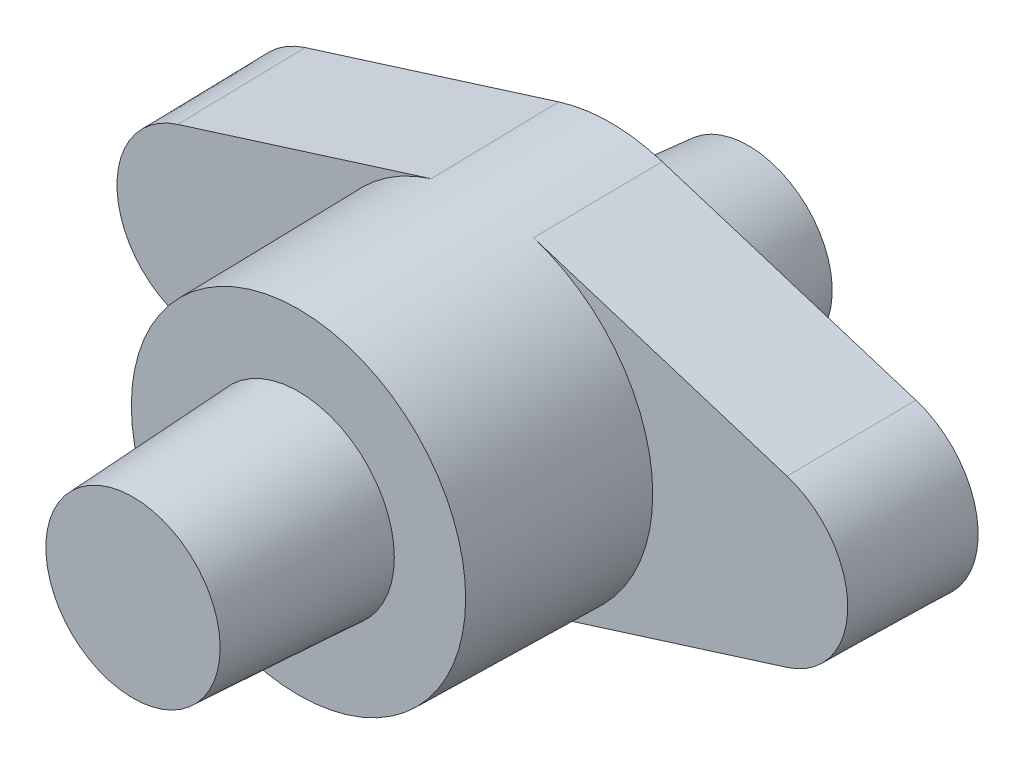
ISO-10303-21;
HEADER;
FILE_DESCRIPTION(('STEP AP214'),'2;1');
FILE_NAME('part.step','',(''),(''),'','','');
FILE_SCHEMA(('AUTOMOTIVE_DESIGN { 1 0 10303 214 1 1 1 1 }'));
ENDSEC;
DATA;
#1=APPLICATION_CONTEXT('core data for automotive mechanical design processes');
#2=APPLICATION_PROTOCOL_DEFINITION('international standard','automotive_design',2000,#1);
#3=PRODUCT_CONTEXT('',#1,'mechanical');
#4=PRODUCT('Part','Part','',(#3));
#5=PRODUCT_RELATED_PRODUCT_CATEGORY('part','',(#4));
#6=PRODUCT_DEFINITION_FORMATION('','',#4);
#7=PRODUCT_DEFINITION_CONTEXT('part definition',#1,'design');
#8=PRODUCT_DEFINITION('design','',#6,#7);
#9=PRODUCT_DEFINITION_SHAPE('','',#8);
#10=(LENGTH_UNIT() NAMED_UNIT(*) SI_UNIT(.MILLI.,.METRE.));
#11=(NAMED_UNIT(*) PLANE_ANGLE_UNIT() SI_UNIT($,.RADIAN.));
#12=(NAMED_UNIT(*) SI_UNIT($,.STERADIAN.) SOLID_ANGLE_UNIT());
#13=UNCERTAINTY_MEASURE_WITH_UNIT(LENGTH_MEASURE(1.E-05),#10,'distance_accuracy_value','');
#14=(GEOMETRIC_REPRESENTATION_CONTEXT(3) GLOBAL_UNCERTAINTY_ASSIGNED_CONTEXT((#13)) GLOBAL_UNIT_ASSIGNED_CONTEXT((#10,
#11,#12)) REPRESENTATION_CONTEXT('',''));
#15=CARTESIAN_POINT('',(0.,0.,0.));
#16=DIRECTION('',(0.,0.,1.));
#17=DIRECTION('',(1.,0.,0.));
#18=AXIS2_PLACEMENT_3D('',#15,#16,#17);
#19=CARTESIAN_POINT('',(0.,0.,53.3387391971892));
#20=DIRECTION('',(0.,0.,-1.));
#21=DIRECTION('',(1.,0.,0.));
#22=AXIS2_PLACEMENT_3D('',#19,#20,#21);
#23=CONICAL_SURFACE('',#22,17.37,0.05235987755983);
#24=CARTESIAN_POINT('',(0.,0.,83.3387391971892));
#25=DIRECTION('',(0.,0.,1.));
#26=DIRECTION('',(1.,0.,0.));
#27=AXIS2_PLACEMENT_3D('',#24,#25,#26);
#28=CIRCLE('',#27,15.7977666215088);
#29=CARTESIAN_POINT('',(15.7977666215088,0.,83.3387391971892));
#30=VERTEX_POINT('',#29);
#31=EDGE_CURVE('E12',#30,#30,#28,.T.);
#32=ORIENTED_EDGE('',*,*,#31,.F.);
#33=EDGE_LOOP('',(#32));
#34=FACE_BOUND('',#33,.T.);
#35=CARTESIAN_POINT('',(0.,0.,53.3387391971892));
#36=DIRECTION('',(0.,0.,1.));
#37=DIRECTION('',(1.,0.,0.));
#38=AXIS2_PLACEMENT_3D('',#35,#36,#37);
#39=CIRCLE('',#38,17.37);
#40=CARTESIAN_POINT('',(17.37,0.,53.3387391971892));
#41=VERTEX_POINT('',#40);
#42=EDGE_CURVE('E114',#41,#41,#39,.T.);
#43=ORIENTED_EDGE('',*,*,#42,.T.);
#44=EDGE_LOOP('',(#43));
#45=FACE_BOUND('',#44,.T.);
#46=ADVANCED_FACE('F43',(#34,#45),#23,.T.);
#47=CARTESIAN_POINT('',(0.,0.,83.3387391971892));
#48=DIRECTION('',(0.,0.,1.));
#49=DIRECTION('',(1.,0.,0.));
#50=AXIS2_PLACEMENT_3D('',#47,#48,#49);
#51=PLANE('',#50);
#52=ORIENTED_EDGE('',*,*,#31,.T.);
#53=EDGE_LOOP('',(#52));
#54=FACE_BOUND('',#53,.T.);
#55=ADVANCED_FACE('F225',(#54),#51,.T.);
#56=CARTESIAN_POINT('',(0.,0.,53.3387391971892));
#57=DIRECTION('',(0.,0.,1.));
#58=DIRECTION('',(1.,0.,0.));
#59=AXIS2_PLACEMENT_3D('',#56,#57,#58);
#60=PLANE('',#59);
#61=CARTESIAN_POINT('',(0.,0.,53.3387391971892));
#62=DIRECTION('',(0.,0.,1.));
#63=DIRECTION('',(1.,0.,0.));
#64=AXIS2_PLACEMENT_3D('',#61,#62,#63);
#65=CIRCLE('',#64,30.3);
#66=CARTESIAN_POINT('',(30.3,0.,53.3387391971892));
#67=VERTEX_POINT('',#66);
#68=EDGE_CURVE('E296',#67,#67,#65,.T.);
#69=ORIENTED_EDGE('',*,*,#68,.T.);
#70=EDGE_LOOP('',(#69));
#71=FACE_BOUND('',#70,.T.);
#72=ORIENTED_EDGE('',*,*,#42,.F.);
#73=EDGE_LOOP('',(#72));
#74=FACE_BOUND('',#73,.T.);
#75=ADVANCED_FACE('F219',(#71,#74),#60,.T.);
#76=CARTESIAN_POINT('',(50.5,0.,20.0087391971892));
#77=DIRECTION('',(0.,0.,1.));
#78=DIRECTION('',(1.,0.,0.));
#79=AXIS2_PLACEMENT_3D('',#76,#77,#78);
#80=PLANE('',#79);
#81=CARTESIAN_POINT('',(0.,0.,20.0087391971892));
#82=DIRECTION('',(0.,0.,1.));
#83=DIRECTION('',(1.,0.,0.));
#84=AXIS2_PLACEMENT_3D('',#81,#82,#83);
#85=CIRCLE('',#84,30.8817773140575);
#86=CARTESIAN_POINT('',(-9.26453319421725,29.459337989308,20.0087391971892));
#87=VERTEX_POINT('',#86);
#88=CARTESIAN_POINT('',(-9.26453319421725,-29.459337989308,20.0087391971892));
#89=VERTEX_POINT('',#88);
#90=EDGE_CURVE('E88',#87,#89,#85,.T.);
#91=ORIENTED_EDGE('',*,*,#90,.F.);
#92=DIRECTION('',(0.953939201416946,0.3,0.));
#93=VECTOR('',#92,1.);
#94=CARTESIAN_POINT('',(-9.26453319421725,29.459337989308,20.0087391971892));
#95=LINE('',#94,#93);
#96=CARTESIAN_POINT('',(-55.2195331942173,15.0071590878412,20.0087391971892));
#97=VERTEX_POINT('',#96);
#98=EDGE_CURVE('E123',#87,#97,#95,.F.);
#99=ORIENTED_EDGE('',*,*,#98,.T.);
#100=CARTESIAN_POINT('',(-50.5,0.,20.0087391971892));
#101=DIRECTION('',(0.,0.,1.));
#102=DIRECTION('',(1.,0.,0.));
#103=AXIS2_PLACEMENT_3D('',#100,#101,#102);
#104=CIRCLE('',#103,15.7317773140575);
#105=CARTESIAN_POINT('',(-55.2195331942172,-15.0071590878412,20.0087391971892));
#106=VERTEX_POINT('',#105);
#107=EDGE_CURVE('E82',#97,#106,#104,.T.);
#108=ORIENTED_EDGE('',*,*,#107,.T.);
#109=DIRECTION('',(-0.953939201416946,0.3,0.));
#110=VECTOR('',#109,1.);
#111=CARTESIAN_POINT('',(-9.26453319421725,-29.459337989308,20.0087391971892));
#112=LINE('',#111,#110);
#113=EDGE_CURVE('E47',#106,#89,#112,.F.);
#114=ORIENTED_EDGE('',*,*,#113,.T.);
#115=EDGE_LOOP('',(#91,#99,#108,#114));
#116=FACE_BOUND('',#115,.T.);
#117=ADVANCED_FACE('F86',(#116),#80,.T.);
#118=CARTESIAN_POINT('',(0.,0.,20.0087391971892));
#119=DIRECTION('',(0.,0.,1.));
#120=DIRECTION('',(1.,0.,0.));
#121=AXIS2_PLACEMENT_3D('',#118,#119,#120);
#122=CIRCLE('',#121,30.8817773140575);
#123=CARTESIAN_POINT('',(9.26453319421724,-29.4593379893079,20.0087391971892));
#124=VERTEX_POINT('',#123);
#125=CARTESIAN_POINT('',(9.26453319421724,29.459337989308,20.0087391971892));
#126=VERTEX_POINT('',#125);
#127=EDGE_CURVE('E111',#124,#126,#122,.T.);
#128=ORIENTED_EDGE('',*,*,#127,.F.);
#129=DIRECTION('',(-0.953939201416946,-0.3,0.));
#130=VECTOR('',#129,1.);
#131=CARTESIAN_POINT('',(9.26453319421724,-29.4593379893079,20.0087391971892));
#132=LINE('',#131,#130);
#133=CARTESIAN_POINT('',(55.2195331942172,-15.0071590878412,20.0087391971892));
#134=VERTEX_POINT('',#133);
#135=EDGE_CURVE('E63',#124,#134,#132,.F.);
#136=ORIENTED_EDGE('',*,*,#135,.T.);
#137=CARTESIAN_POINT('',(50.5,0.,20.0087391971892));
#138=DIRECTION('',(0.,0.,1.));
#139=DIRECTION('',(1.,0.,0.));
#140=AXIS2_PLACEMENT_3D('',#137,#138,#139);
#141=CIRCLE('',#140,15.7317773140575);
#142=CARTESIAN_POINT('',(55.2195331942172,15.0071590878412,20.0087391971892));
#143=VERTEX_POINT('',#142);
#144=EDGE_CURVE('E121',#134,#143,#141,.T.);
#145=ORIENTED_EDGE('',*,*,#144,.T.);
#146=DIRECTION('',(0.953939201416946,-0.3,0.));
#147=VECTOR('',#146,1.);
#148=CARTESIAN_POINT('',(9.26453319421725,29.459337989308,20.0087391971892));
#149=LINE('',#148,#147);
#150=EDGE_CURVE('E124',#143,#126,#149,.F.);
#151=ORIENTED_EDGE('',*,*,#150,.T.);
#152=EDGE_LOOP('',(#128,#136,#145,#151));
#153=FACE_BOUND('',#152,.T.);
#154=ADVANCED_FACE('F260',(#153),#80,.T.);
#155=CARTESIAN_POINT('',(50.5,0.,-3.22126080281077));
#156=DIRECTION('',(0.,0.,1.));
#157=DIRECTION('',(1.,0.,0.));
#158=AXIS2_PLACEMENT_3D('',#155,#156,#157);
#159=PLANE('',#158);
#160=CARTESIAN_POINT('',(0.,0.,-3.22126080281077));
#161=DIRECTION('',(0.,0.,1.));
#162=DIRECTION('',(1.,0.,0.));
#163=AXIS2_PLACEMENT_3D('',#160,#161,#162);
#164=CIRCLE('',#163,17.37);
#165=CARTESIAN_POINT('',(17.37,0.,-3.22126080281077));
#166=VERTEX_POINT('',#165);
#167=EDGE_CURVE('E110',#166,#166,#164,.F.);
#168=ORIENTED_EDGE('',*,*,#167,.F.);
#169=EDGE_LOOP('',(#168));
#170=FACE_BOUND('',#169,.T.);
#171=CARTESIAN_POINT('',(50.5,0.,-3.22126080281077));
#172=DIRECTION('',(0.,0.,1.));
#173=DIRECTION('',(1.,0.,0.));
#174=AXIS2_PLACEMENT_3D('',#171,#172,#173);
#175=CIRCLE('',#174,16.13725847234);
#176=CARTESIAN_POINT('',(55.341177541702,-15.3939634601628,-3.22126080281077));
#177=VERTEX_POINT('',#176);
#178=CARTESIAN_POINT('',(55.341177541702,15.3939634601629,-3.22126080281077));
#179=VERTEX_POINT('',#178);
#180=EDGE_CURVE('E154',#177,#179,#175,.T.);
#181=ORIENTED_EDGE('',*,*,#180,.F.);
#182=DIRECTION('',(-0.953939201416946,-0.3,0.));
#183=VECTOR('',#182,1.);
#184=CARTESIAN_POINT('',(9.38617754170199,-29.8461423616296,-3.22126080281077));
#185=LINE('',#184,#183);
#186=CARTESIAN_POINT('',(9.38617754170199,-29.8461423616296,-3.22126080281077));
#187=VERTEX_POINT('',#186);
#188=EDGE_CURVE('E129',#187,#177,#185,.F.);
#189=ORIENTED_EDGE('',*,*,#188,.F.);
#190=CARTESIAN_POINT('',(0.,0.,-3.22126080281077));
#191=DIRECTION('',(0.,0.,1.));
#192=DIRECTION('',(1.,0.,0.));
#193=AXIS2_PLACEMENT_3D('',#190,#191,#192);
#194=CIRCLE('',#193,31.28725847234);
#195=CARTESIAN_POINT('',(-9.386177541702,-29.8461423616296,-3.22126080281077));
#196=VERTEX_POINT('',#195);
#197=EDGE_CURVE('E159',#196,#187,#194,.T.);
#198=ORIENTED_EDGE('',*,*,#197,.F.);
#199=DIRECTION('',(-0.953939201416946,0.3,0.));
#200=VECTOR('',#199,1.);
#201=CARTESIAN_POINT('',(-9.386177541702,-29.8461423616296,-3.22126080281077));
#202=LINE('',#201,#200);
#203=CARTESIAN_POINT('',(-55.341177541702,-15.3939634601629,-3.22126080281077));
#204=VERTEX_POINT('',#203);
#205=EDGE_CURVE('E97',#204,#196,#202,.F.);
#206=ORIENTED_EDGE('',*,*,#205,.F.);
#207=CARTESIAN_POINT('',(-50.5,0.,-3.22126080281077));
#208=DIRECTION('',(0.,0.,1.));
#209=DIRECTION('',(1.,0.,0.));
#210=AXIS2_PLACEMENT_3D('',#207,#208,#209);
#211=CIRCLE('',#210,16.13725847234);
#212=CARTESIAN_POINT('',(-55.341177541702,15.3939634601628,-3.22126080281077));
#213=VERTEX_POINT('',#212);
#214=EDGE_CURVE('E162',#213,#204,#211,.T.);
#215=ORIENTED_EDGE('',*,*,#214,.F.);
#216=DIRECTION('',(0.953939201416946,0.3,0.));
#217=VECTOR('',#216,1.);
#218=CARTESIAN_POINT('',(-9.386177541702,29.8461423616296,-3.22126080281077));
#219=LINE('',#218,#217);
#220=CARTESIAN_POINT('',(-9.386177541702,29.8461423616296,-3.22126080281077));
#221=VERTEX_POINT('',#220);
#222=EDGE_CURVE('E164',#221,#213,#219,.F.);
#223=ORIENTED_EDGE('',*,*,#222,.F.);
#224=CARTESIAN_POINT('',(0.,0.,-3.22126080281077));
#225=DIRECTION('',(0.,0.,1.));
#226=DIRECTION('',(1.,0.,0.));
#227=AXIS2_PLACEMENT_3D('',#224,#225,#226);
#228=CIRCLE('',#227,31.28725847234);
#229=CARTESIAN_POINT('',(9.38617754170199,29.8461423616296,-3.22126080281077));
#230=VERTEX_POINT('',#229);
#231=EDGE_CURVE('E131',#230,#221,#228,.T.);
#232=ORIENTED_EDGE('',*,*,#231,.F.);
#233=DIRECTION('',(0.953939201416946,-0.3,0.));
#234=VECTOR('',#233,1.);
#235=CARTESIAN_POINT('',(9.386177541702,29.8461423616296,-3.22126080281077));
#236=LINE('',#235,#234);
#237=EDGE_CURVE('E151',#179,#230,#236,.F.);
#238=ORIENTED_EDGE('',*,*,#237,.F.);
#239=EDGE_LOOP('',(#181,#189,#198,#206,#215,#223,#232,#238));
#240=FACE_BOUND('',#239,.T.);
#241=ADVANCED_FACE('F179',(#170,#240),#159,.F.);
#242=CARTESIAN_POINT('',(50.5,0.,53.3387391971892));
#243=DIRECTION('',(0.,0.,-1.));
#244=DIRECTION('',(1.,0.,0.));
#245=AXIS2_PLACEMENT_3D('',#242,#243,#244);
#246=CONICAL_SURFACE('',#245,15.15,0.0174532925199433);
#247=ORIENTED_EDGE('',*,*,#180,.T.);
#248=DIRECTION('',(0.00523572193118507,0.0166485346595862,-0.999847695156391));
#249=VECTOR('',#248,1.);
#250=CARTESIAN_POINT('',(55.045,14.4521789014667,53.3387391971892));
#251=LINE('',#250,#249);
#252=EDGE_CURVE('E117',#143,#179,#251,.T.);
#253=ORIENTED_EDGE('',*,*,#252,.F.);
#254=ORIENTED_EDGE('',*,*,#144,.F.);
#255=DIRECTION('',(0.00523572193118506,-0.0166485346595862,-0.999847695156391));
#256=VECTOR('',#255,1.);
#257=CARTESIAN_POINT('',(55.045,-14.4521789014667,53.3387391971892));
#258=LINE('',#257,#256);
#259=EDGE_CURVE('E133',#134,#177,#258,.T.);
#260=ORIENTED_EDGE('',*,*,#259,.T.);
#261=EDGE_LOOP('',(#247,#253,#254,#260));
#262=FACE_BOUND('',#261,.T.);
#263=ADVANCED_FACE('F199',(#262),#246,.T.);
#264=CARTESIAN_POINT('',(9.09,28.9043578029335,53.3387391971892));
#265=DIRECTION('',(0.299954308546917,0.953793911856062,0.0174524064372835));
#266=DIRECTION('',(-0.953939201416946,0.3,0.));
#267=AXIS2_PLACEMENT_3D('',#264,#265,#266);
#268=PLANE('',#267);
#269=ORIENTED_EDGE('',*,*,#237,.T.);
#270=DIRECTION('',(0.00523572193118506,0.0166485346595862,-0.999847695156391));
#271=VECTOR('',#270,1.);
#272=CARTESIAN_POINT('',(9.08999999999999,28.9043578029334,53.3387391971892));
#273=LINE('',#272,#271);
#274=EDGE_CURVE('E145',#126,#230,#273,.T.);
#275=ORIENTED_EDGE('',*,*,#274,.F.);
#276=ORIENTED_EDGE('',*,*,#150,.F.);
#277=ORIENTED_EDGE('',*,*,#252,.T.);
#278=EDGE_LOOP('',(#269,#275,#276,#277));
#279=FACE_BOUND('',#278,.T.);
#280=ADVANCED_FACE('F232',(#279),#268,.T.);
#281=CARTESIAN_POINT('',(-9.09000000000001,28.9043578029335,53.3387391971892));
#282=DIRECTION('',(-0.299954308546917,0.953793911856062,0.0174524064372835));
#283=DIRECTION('',(-0.953939201416946,-0.3,0.));
#284=AXIS2_PLACEMENT_3D('',#281,#282,#283);
#285=PLANE('',#284);
#286=ORIENTED_EDGE('',*,*,#222,.T.);
#287=DIRECTION('',(-0.00523572193118507,0.0166485346595862,-0.999847695156391));
#288=VECTOR('',#287,1.);
#289=CARTESIAN_POINT('',(-55.045,14.4521789014667,53.3387391971892));
#290=LINE('',#289,#288);
#291=EDGE_CURVE('E146',#97,#213,#290,.T.);
#292=ORIENTED_EDGE('',*,*,#291,.F.);
#293=ORIENTED_EDGE('',*,*,#98,.F.);
#294=DIRECTION('',(-0.00523572193118507,0.0166485346595862,-0.999847695156391));
#295=VECTOR('',#294,1.);
#296=CARTESIAN_POINT('',(-9.09,28.9043578029335,53.3387391971892));
#297=LINE('',#296,#295);
#298=EDGE_CURVE('E108',#87,#221,#297,.T.);
#299=ORIENTED_EDGE('',*,*,#298,.T.);
#300=EDGE_LOOP('',(#286,#292,#293,#299));
#301=FACE_BOUND('',#300,.T.);
#302=ADVANCED_FACE('F177',(#301),#285,.T.);
#303=CARTESIAN_POINT('',(-50.5,0.,53.3387391971892));
#304=DIRECTION('',(0.,0.,-1.));
#305=DIRECTION('',(1.,0.,0.));
#306=AXIS2_PLACEMENT_3D('',#303,#304,#305);
#307=CONICAL_SURFACE('',#306,15.15,0.0174532925199433);
#308=ORIENTED_EDGE('',*,*,#214,.T.);
#309=DIRECTION('',(-0.00523572193118506,-0.0166485346595862,-0.999847695156391));
#310=VECTOR('',#309,1.);
#311=CARTESIAN_POINT('',(-55.045,-14.4521789014667,53.3387391971892));
#312=LINE('',#311,#310);
#313=EDGE_CURVE('E101',#106,#204,#312,.T.);
#314=ORIENTED_EDGE('',*,*,#313,.F.);
#315=ORIENTED_EDGE('',*,*,#107,.F.);
#316=ORIENTED_EDGE('',*,*,#291,.T.);
#317=EDGE_LOOP('',(#308,#314,#315,#316));
#318=FACE_BOUND('',#317,.T.);
#319=ADVANCED_FACE('F183',(#318),#307,.T.);
#320=CARTESIAN_POINT('',(-9.09,-28.9043578029335,53.3387391971892));
#321=DIRECTION('',(-0.299954308546917,-0.953793911856062,0.0174524064372835));
#322=DIRECTION('',(0.953939201416946,-0.3,0.));
#323=AXIS2_PLACEMENT_3D('',#320,#321,#322);
#324=PLANE('',#323);
#325=ORIENTED_EDGE('',*,*,#205,.T.);
#326=DIRECTION('',(-0.00523572193118507,-0.0166485346595862,-0.999847695156391));
#327=VECTOR('',#326,1.);
#328=CARTESIAN_POINT('',(-9.09,-28.9043578029334,53.3387391971892));
#329=LINE('',#328,#327);
#330=EDGE_CURVE('E94',#89,#196,#329,.T.);
#331=ORIENTED_EDGE('',*,*,#330,.F.);
#332=ORIENTED_EDGE('',*,*,#113,.F.);
#333=ORIENTED_EDGE('',*,*,#313,.T.);
#334=EDGE_LOOP('',(#325,#331,#332,#333));
#335=FACE_BOUND('',#334,.T.);
#336=ADVANCED_FACE('F45',(#335),#324,.T.);
#337=CARTESIAN_POINT('',(0.,0.,53.3387391971892));
#338=DIRECTION('',(0.,0.,-1.));
#339=DIRECTION('',(1.,0.,0.));
#340=AXIS2_PLACEMENT_3D('',#337,#338,#339);
#341=CONICAL_SURFACE('',#340,30.3,0.0174532925199433);
#342=ORIENTED_EDGE('',*,*,#197,.T.);
#343=DIRECTION('',(0.00523572193118506,-0.0166485346595862,-0.999847695156391));
#344=VECTOR('',#343,1.);
#345=CARTESIAN_POINT('',(9.08999999999999,-28.9043578029334,53.3387391971892));
#346=LINE('',#345,#344);
#347=EDGE_CURVE('E102',#124,#187,#346,.T.);
#348=ORIENTED_EDGE('',*,*,#347,.F.);
#349=ORIENTED_EDGE('',*,*,#127,.T.);
#350=ORIENTED_EDGE('',*,*,#274,.T.);
#351=ORIENTED_EDGE('',*,*,#231,.T.);
#352=ORIENTED_EDGE('',*,*,#298,.F.);
#353=ORIENTED_EDGE('',*,*,#90,.T.);
#354=ORIENTED_EDGE('',*,*,#330,.T.);
#355=EDGE_LOOP('',(#342,#348,#349,#350,#351,#352,#353,#354));
#356=FACE_BOUND('',#355,.T.);
#357=ORIENTED_EDGE('',*,*,#68,.F.);
#358=EDGE_LOOP('',(#357));
#359=FACE_BOUND('',#358,.T.);
#360=ADVANCED_FACE('F104',(#356,#359),#341,.T.);
#361=CARTESIAN_POINT('',(9.08999999999999,-28.9043578029334,53.3387391971892));
#362=DIRECTION('',(0.299954308546917,-0.953793911856062,0.0174524064372835));
#363=DIRECTION('',(0.953939201416946,0.3,0.));
#364=AXIS2_PLACEMENT_3D('',#361,#362,#363);
#365=PLANE('',#364);
#366=ORIENTED_EDGE('',*,*,#188,.T.);
#367=ORIENTED_EDGE('',*,*,#259,.F.);
#368=ORIENTED_EDGE('',*,*,#135,.F.);
#369=ORIENTED_EDGE('',*,*,#347,.T.);
#370=EDGE_LOOP('',(#366,#367,#368,#369));
#371=FACE_BOUND('',#370,.T.);
#372=ADVANCED_FACE('F197',(#371),#365,.T.);
#373=CARTESIAN_POINT('',(0.,0.,-3.22126080281077));
#374=DIRECTION('',(0.,0.,1.));
#375=DIRECTION('',(-1.,0.,0.));
#376=AXIS2_PLACEMENT_3D('',#373,#374,#375);
#377=CONICAL_SURFACE('',#376,17.37,0.0872664625997166);
#378=CARTESIAN_POINT('',(0.,0.,-28.2212608028108));
#379=DIRECTION('',(0.,0.,-1.));
#380=DIRECTION('',(-1.,0.,0.));
#381=AXIS2_PLACEMENT_3D('',#378,#379,#380);
#382=CIRCLE('',#381,15.1827834118519);
#383=CARTESIAN_POINT('',(-15.1827834118519,0.,-28.2212608028108));
#384=VERTEX_POINT('',#383);
#385=EDGE_CURVE('E297',#384,#384,#382,.T.);
#386=ORIENTED_EDGE('',*,*,#385,.F.);
#387=EDGE_LOOP('',(#386));
#388=FACE_BOUND('',#387,.T.);
#389=ORIENTED_EDGE('',*,*,#167,.T.);
#390=EDGE_LOOP('',(#389));
#391=FACE_BOUND('',#390,.T.);
#392=ADVANCED_FACE('F243',(#388,#391),#377,.T.);
#393=CARTESIAN_POINT('',(0.,0.,-28.2212608028108));
#394=DIRECTION('',(0.,0.,-1.));
#395=DIRECTION('',(-1.,0.,0.));
#396=AXIS2_PLACEMENT_3D('',#393,#394,#395);
#397=PLANE('',#396);
#398=ORIENTED_EDGE('',*,*,#385,.T.);
#399=EDGE_LOOP('',(#398));
#400=FACE_BOUND('',#399,.T.);
#401=ADVANCED_FACE('F247',(#400),#397,.T.);
#402=CLOSED_SHELL('',(#46,#55,#75,#117,#154,#241,#263,#280,#302,#319,#336,#360,#372,#392,#401));
#403=CARTESIAN_POINT('',(0.,0.,-28.0212608028108));
#404=DIRECTION('',(0.,0.,-1.));
#405=DIRECTION('',(-1.,0.,0.));
#406=AXIS2_PLACEMENT_3D('',#403,#404,#405);
#407=PLANE('',#406);
#408=CARTESIAN_POINT('',(0.,0.,-28.0212608028108));
#409=DIRECTION('',(0.,0.,-1.));
#410=DIRECTION('',(-1.,0.,0.));
#411=AXIS2_PLACEMENT_3D('',#408,#409,#410);
#412=CIRCLE('',#411,14.9995171770484);
#413=CARTESIAN_POINT('',(-14.9995171770484,0.,-28.0212608028108));
#414=VERTEX_POINT('',#413);
#415=EDGE_CURVE('E302',#414,#414,#412,.T.);
#416=ORIENTED_EDGE('',*,*,#415,.F.);
#417=EDGE_LOOP('',(#416));
#418=FACE_BOUND('',#417,.T.);
#419=ADVANCED_FACE('F314',(#418),#407,.F.);
#420=CARTESIAN_POINT('',(0.,0.,-3.20382965426124));
#421=DIRECTION('',(0.,0.,1.));
#422=DIRECTION('',(-1.,0.,0.));
#423=AXIS2_PLACEMENT_3D('',#420,#421,#422);
#424=CONICAL_SURFACE('',#423,17.1707610603817,0.0872664625997166);
#425=ORIENTED_EDGE('',*,*,#415,.T.);
#426=EDGE_LOOP('',(#425));
#427=FACE_BOUND('',#426,.T.);
#428=CARTESIAN_POINT('',(0.,0.,-3.22126080281077));
#429=DIRECTION('',(0.,0.,-1.));
#430=DIRECTION('',(-1.,0.,0.));
#431=AXIS2_PLACEMENT_3D('',#428,#429,#430);
#432=CIRCLE('',#431,17.1692360324913);
#433=CARTESIAN_POINT('',(-17.1692360324913,0.,-3.22126080281077));
#434=VERTEX_POINT('',#433);
#435=EDGE_CURVE('E305',#434,#434,#432,.T.);
#436=ORIENTED_EDGE('',*,*,#435,.F.);
#437=EDGE_LOOP('',(#436));
#438=FACE_BOUND('',#437,.T.);
#439=ADVANCED_FACE('F311',(#427,#438),#424,.F.);
#440=CARTESIAN_POINT('',(0.,0.,-3.22126080281077));
#441=DIRECTION('',(0.,0.,-1.));
#442=DIRECTION('',(-1.,0.,0.));
#443=AXIS2_PLACEMENT_3D('',#440,#441,#442);
#444=PLANE('',#443);
#445=ORIENTED_EDGE('',*,*,#435,.T.);
#446=EDGE_LOOP('',(#445));
#447=FACE_BOUND('',#446,.T.);
#448=CARTESIAN_POINT('',(0.,0.,-3.22126080281077));
#449=DIRECTION('',(0.,0.,1.));
#450=DIRECTION('',(1.,0.,0.));
#451=AXIS2_PLACEMENT_3D('',#448,#449,#450);
#452=CIRCLE('',#451,17.17);
#453=CARTESIAN_POINT('',(17.17,0.,-3.22126080281077));
#454=VERTEX_POINT('',#453);
#455=EDGE_CURVE('E156',#454,#454,#452,.T.);
#456=ORIENTED_EDGE('',*,*,#455,.T.);
#457=EDGE_LOOP('',(#456));
#458=FACE_BOUND('',#457,.T.);
#459=ADVANCED_FACE('F259',(#447,#458),#444,.F.);
#460=CARTESIAN_POINT('',(0.,0.,20.0087391971892));
#461=DIRECTION('',(0.,0.,-1.));
#462=DIRECTION('',(-1.,0.,0.));
#463=AXIS2_PLACEMENT_3D('',#460,#461,#462);
#464=CYLINDRICAL_SURFACE('',#463,17.17);
#465=ORIENTED_EDGE('',*,*,#455,.F.);
#466=EDGE_LOOP('',(#465));
#467=FACE_BOUND('',#466,.T.);
#468=CARTESIAN_POINT('',(0.,0.,53.3387391971892));
#469=DIRECTION('',(0.,0.,1.));
#470=DIRECTION('',(1.,0.,0.));
#471=AXIS2_PLACEMENT_3D('',#468,#469,#470);
#472=CIRCLE('',#471,17.17);
#473=CARTESIAN_POINT('',(17.17,0.,53.3387391971892));
#474=VERTEX_POINT('',#473);
#475=EDGE_CURVE('E281',#474,#474,#472,.T.);
#476=ORIENTED_EDGE('',*,*,#475,.T.);
#477=EDGE_LOOP('',(#476));
#478=FACE_BOUND('',#477,.T.);
#479=ADVANCED_FACE('F223',(#467,#478),#464,.F.);
#480=CARTESIAN_POINT('',(0.,0.,83.1387391971892));
#481=DIRECTION('',(0.,0.,1.));
#482=DIRECTION('',(1.,0.,0.));
#483=AXIS2_PLACEMENT_3D('',#480,#481,#482);
#484=PLANE('',#483);
#485=CARTESIAN_POINT('',(0.,0.,83.1387391971892));
#486=DIRECTION('',(0.,0.,1.));
#487=DIRECTION('',(1.,0.,0.));
#488=AXIS2_PLACEMENT_3D('',#485,#486,#487);
#489=CIRCLE('',#488,15.6079737081658);
#490=CARTESIAN_POINT('',(15.6079737081658,0.,83.1387391971892));
#491=VERTEX_POINT('',#490);
#492=EDGE_CURVE('E54',#491,#491,#489,.T.);
#493=ORIENTED_EDGE('',*,*,#492,.F.);
#494=EDGE_LOOP('',(#493));
#495=FACE_BOUND('',#494,.T.);
#496=ADVANCED_FACE('F216',(#495),#484,.F.);
#497=CARTESIAN_POINT('',(0.,0.,53.3282720059407));
#498=DIRECTION('',(0.,0.,-1.));
#499=DIRECTION('',(1.,0.,0.));
#500=AXIS2_PLACEMENT_3D('',#497,#498,#499);
#501=CONICAL_SURFACE('',#500,17.1702740930491,0.05235987755983);
#502=ORIENTED_EDGE('',*,*,#492,.T.);
#503=EDGE_LOOP('',(#502));
#504=FACE_BOUND('',#503,.T.);
#505=ORIENTED_EDGE('',*,*,#475,.F.);
#506=EDGE_LOOP('',(#505));
#507=FACE_BOUND('',#506,.T.);
#508=ADVANCED_FACE('F206',(#504,#507),#501,.F.);
#509=CLOSED_SHELL('',(#419,#439,#459,#479,#496,#508));
#510=ORIENTED_CLOSED_SHELL('',*,#509,.T.);
#511=BREP_WITH_VOIDS('B2',#402,(#510));
#512=ADVANCED_BREP_SHAPE_REPRESENTATION('',(#18,#511),#14);
#513=SHAPE_DEFINITION_REPRESENTATION(#9,#512);
ENDSEC;
END-ISO-10303-21;
